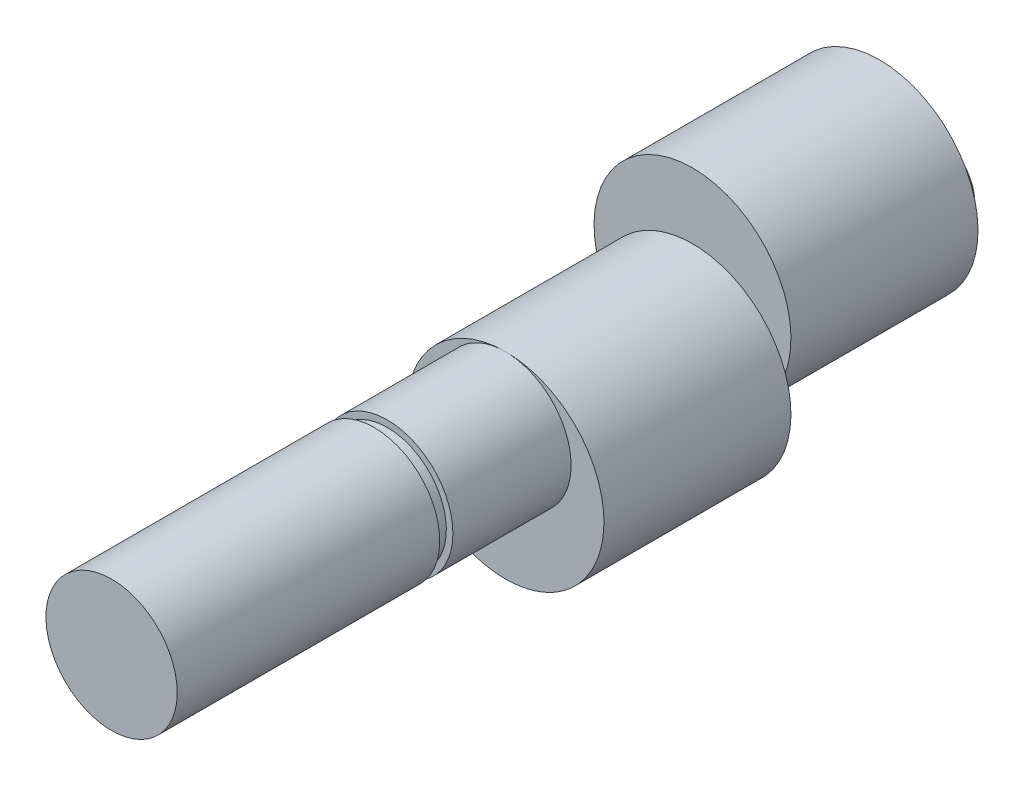
ISO-10303-21;
HEADER;
FILE_DESCRIPTION(('STEP AP214'),'2;1');
FILE_NAME('part.step','',(''),(''),'','','');
FILE_SCHEMA(('AUTOMOTIVE_DESIGN { 1 0 10303 214 1 1 1 1 }'));
ENDSEC;
DATA;
#1=APPLICATION_CONTEXT('core data for automotive mechanical design processes');
#2=APPLICATION_PROTOCOL_DEFINITION('international standard','automotive_design',2000,#1);
#3=PRODUCT_CONTEXT('',#1,'mechanical');
#4=PRODUCT('Part','Part','',(#3));
#5=PRODUCT_RELATED_PRODUCT_CATEGORY('part','',(#4));
#6=PRODUCT_DEFINITION_FORMATION('','',#4);
#7=PRODUCT_DEFINITION_CONTEXT('part definition',#1,'design');
#8=PRODUCT_DEFINITION('design','',#6,#7);
#9=PRODUCT_DEFINITION_SHAPE('','',#8);
#10=(LENGTH_UNIT() NAMED_UNIT(*) SI_UNIT(.MILLI.,.METRE.));
#11=(NAMED_UNIT(*) PLANE_ANGLE_UNIT() SI_UNIT($,.RADIAN.));
#12=(NAMED_UNIT(*) SI_UNIT($,.STERADIAN.) SOLID_ANGLE_UNIT());
#13=UNCERTAINTY_MEASURE_WITH_UNIT(LENGTH_MEASURE(1.E-05),#10,'distance_accuracy_value','');
#14=(GEOMETRIC_REPRESENTATION_CONTEXT(3) GLOBAL_UNCERTAINTY_ASSIGNED_CONTEXT((#13)) GLOBAL_UNIT_ASSIGNED_CONTEXT((#10,
#11,#12)) REPRESENTATION_CONTEXT('',''));
#15=CARTESIAN_POINT('',(0.,0.,0.));
#16=DIRECTION('',(0.,0.,1.));
#17=DIRECTION('',(1.,0.,0.));
#18=AXIS2_PLACEMENT_3D('',#15,#16,#17);
#19=CARTESIAN_POINT('',(0.,0.,44.25));
#20=DIRECTION('',(0.,0.,-1.));
#21=DIRECTION('',(-1.,0.,0.));
#22=AXIS2_PLACEMENT_3D('',#19,#20,#21);
#23=CYLINDRICAL_SURFACE('',#22,5.);
#24=CARTESIAN_POINT('',(0.,0.,14.25));
#25=DIRECTION('',(0.,0.,1.));
#26=DIRECTION('',(1.,0.,0.));
#27=AXIS2_PLACEMENT_3D('',#24,#25,#26);
#28=CIRCLE('',#27,5.);
#29=CARTESIAN_POINT('',(0.,5.,14.25));
#30=VERTEX_POINT('',#29);
#31=EDGE_CURVE('E87',#30,#30,#28,.T.);
#32=ORIENTED_EDGE('',*,*,#31,.T.);
#33=EDGE_LOOP('',(#32));
#34=FACE_BOUND('',#33,.T.);
#35=CARTESIAN_POINT('',(0.,0.,23.25));
#36=DIRECTION('',(0.,0.,1.));
#37=DIRECTION('',(0.,-1.,0.));
#38=AXIS2_PLACEMENT_3D('',#35,#36,#37);
#39=CIRCLE('',#38,5.);
#40=CARTESIAN_POINT('',(0.,-5.,23.25));
#41=VERTEX_POINT('',#40);
#42=EDGE_CURVE('E79',#41,#41,#39,.T.);
#43=ORIENTED_EDGE('',*,*,#42,.F.);
#44=EDGE_LOOP('',(#43));
#45=FACE_BOUND('',#44,.T.);
#46=ADVANCED_FACE('F40',(#34,#45),#23,.T.);
#47=CARTESIAN_POINT('',(0.,-2.5,14.25));
#48=DIRECTION('',(0.,0.,-1.));
#49=DIRECTION('',(-1.,0.,0.));
#50=AXIS2_PLACEMENT_3D('',#47,#48,#49);
#51=CYLINDRICAL_SURFACE('',#50,7.5);
#52=CARTESIAN_POINT('',(0.,-2.5,14.25));
#53=DIRECTION('',(0.,0.,1.));
#54=DIRECTION('',(1.,0.,0.));
#55=AXIS2_PLACEMENT_3D('',#52,#53,#54);
#56=CIRCLE('',#55,7.5);
#57=EDGE_CURVE('E50',#30,#30,#56,.T.);
#58=ORIENTED_EDGE('',*,*,#57,.F.);
#59=EDGE_LOOP('',(#58));
#60=FACE_BOUND('',#59,.T.);
#61=CARTESIAN_POINT('',(0.,-2.5,0.));
#62=DIRECTION('',(0.,0.,1.));
#63=DIRECTION('',(1.,0.,0.));
#64=AXIS2_PLACEMENT_3D('',#61,#62,#63);
#65=CIRCLE('',#64,7.5);
#66=CARTESIAN_POINT('',(7.07106781186547,0.,0.));
#67=VERTEX_POINT('',#66);
#68=CARTESIAN_POINT('',(-7.07106781186547,0.,0.));
#69=VERTEX_POINT('',#68);
#70=EDGE_CURVE('E63',#67,#69,#65,.T.);
#71=ORIENTED_EDGE('',*,*,#70,.T.);
#72=EDGE_CURVE('E75',#69,#67,#65,.T.);
#73=ORIENTED_EDGE('',*,*,#72,.T.);
#74=EDGE_LOOP('',(#71,#73));
#75=FACE_BOUND('',#74,.T.);
#76=ADVANCED_FACE('F42',(#60,#75),#51,.T.);
#77=CARTESIAN_POINT('',(0.,-2.5,14.25));
#78=DIRECTION('',(0.,0.,1.));
#79=DIRECTION('',(1.,0.,0.));
#80=AXIS2_PLACEMENT_3D('',#77,#78,#79);
#81=PLANE('',#80);
#82=ORIENTED_EDGE('',*,*,#57,.T.);
#83=ORIENTED_EDGE('',*,*,#31,.F.);
#84=EDGE_LOOP('',(#82,#83));
#85=FACE_BOUND('',#84,.T.);
#86=ADVANCED_FACE('F142',(#85),#81,.T.);
#87=CARTESIAN_POINT('',(0.,-2.5,0.));
#88=DIRECTION('',(0.,0.,1.));
#89=DIRECTION('',(1.,0.,0.));
#90=AXIS2_PLACEMENT_3D('',#87,#88,#89);
#91=PLANE('',#90);
#92=CARTESIAN_POINT('',(0.,2.5,0.));
#93=DIRECTION('',(0.,0.,-1.));
#94=DIRECTION('',(-1.,0.,0.));
#95=AXIS2_PLACEMENT_3D('',#92,#93,#94);
#96=CIRCLE('',#95,7.5);
#97=EDGE_CURVE('E57',#67,#69,#96,.T.);
#98=ORIENTED_EDGE('',*,*,#97,.F.);
#99=ORIENTED_EDGE('',*,*,#72,.F.);
#100=EDGE_LOOP('',(#98,#99));
#101=FACE_BOUND('',#100,.T.);
#102=ADVANCED_FACE('F223',(#101),#91,.F.);
#103=CARTESIAN_POINT('',(0.,2.5,-14.25));
#104=DIRECTION('',(0.,0.,1.));
#105=DIRECTION('',(1.,0.,0.));
#106=AXIS2_PLACEMENT_3D('',#103,#104,#105);
#107=CYLINDRICAL_SURFACE('',#106,7.5);
#108=CARTESIAN_POINT('',(0.,2.5,-14.25));
#109=DIRECTION('',(0.,0.,-1.));
#110=DIRECTION('',(-1.,0.,0.));
#111=AXIS2_PLACEMENT_3D('',#108,#109,#110);
#112=CIRCLE('',#111,7.5);
#113=CARTESIAN_POINT('',(-7.5,2.5,-14.25));
#114=VERTEX_POINT('',#113);
#115=EDGE_CURVE('E107',#114,#114,#112,.T.);
#116=ORIENTED_EDGE('',*,*,#115,.F.);
#117=EDGE_LOOP('',(#116));
#118=FACE_BOUND('',#117,.T.);
#119=ORIENTED_EDGE('',*,*,#97,.T.);
#120=EDGE_CURVE('E106',#69,#67,#96,.T.);
#121=ORIENTED_EDGE('',*,*,#120,.T.);
#122=EDGE_LOOP('',(#119,#121));
#123=FACE_BOUND('',#122,.T.);
#124=ADVANCED_FACE('F118',(#118,#123),#107,.T.);
#125=CARTESIAN_POINT('',(0.,2.5,-14.25));
#126=DIRECTION('',(0.,0.,-1.));
#127=DIRECTION('',(-1.,0.,0.));
#128=AXIS2_PLACEMENT_3D('',#125,#126,#127);
#129=PLANE('',#128);
#130=CARTESIAN_POINT('',(0.,0.,-14.25));
#131=DIRECTION('',(0.,0.,-1.));
#132=DIRECTION('',(-1.,0.,0.));
#133=AXIS2_PLACEMENT_3D('',#130,#131,#132);
#134=CIRCLE('',#133,3.00000000000004);
#135=CARTESIAN_POINT('',(-3.00000000000004,0.,-14.25));
#136=VERTEX_POINT('',#135);
#137=EDGE_CURVE('E11',#136,#136,#134,.T.);
#138=ORIENTED_EDGE('',*,*,#137,.F.);
#139=EDGE_LOOP('',(#138));
#140=FACE_BOUND('',#139,.T.);
#141=ORIENTED_EDGE('',*,*,#115,.T.);
#142=EDGE_LOOP('',(#141));
#143=FACE_BOUND('',#142,.T.);
#144=ADVANCED_FACE('F123',(#140,#143),#129,.T.);
#145=CARTESIAN_POINT('',(0.,2.5,0.));
#146=DIRECTION('',(0.,0.,-1.));
#147=DIRECTION('',(-1.,0.,0.));
#148=AXIS2_PLACEMENT_3D('',#145,#146,#147);
#149=PLANE('',#148);
#150=ORIENTED_EDGE('',*,*,#70,.F.);
#151=ORIENTED_EDGE('',*,*,#120,.F.);
#152=EDGE_LOOP('',(#150,#151));
#153=FACE_BOUND('',#152,.T.);
#154=ADVANCED_FACE('F120',(#153),#149,.F.);
#155=CARTESIAN_POINT('',(0.,0.,-18.5));
#156=DIRECTION('',(0.,0.,1.));
#157=DIRECTION('',(1.,0.,0.));
#158=AXIS2_PLACEMENT_3D('',#155,#156,#157);
#159=CYLINDRICAL_SURFACE('',#158,3.00000000000004);
#160=CARTESIAN_POINT('',(0.,0.,-18.5));
#161=DIRECTION('',(0.,0.,-1.));
#162=DIRECTION('',(-1.,0.,0.));
#163=AXIS2_PLACEMENT_3D('',#160,#161,#162);
#164=CIRCLE('',#163,3.00000000000004);
#165=CARTESIAN_POINT('',(-3.00000000000004,0.,-18.5));
#166=VERTEX_POINT('',#165);
#167=EDGE_CURVE('E100',#166,#166,#164,.T.);
#168=ORIENTED_EDGE('',*,*,#167,.F.);
#169=EDGE_LOOP('',(#168));
#170=FACE_BOUND('',#169,.T.);
#171=ORIENTED_EDGE('',*,*,#137,.T.);
#172=EDGE_LOOP('',(#171));
#173=FACE_BOUND('',#172,.T.);
#174=ADVANCED_FACE('F122',(#170,#173),#159,.T.);
#175=CARTESIAN_POINT('',(0.,0.,-18.5));
#176=DIRECTION('',(0.,0.,-1.));
#177=DIRECTION('',(-1.,0.,0.));
#178=AXIS2_PLACEMENT_3D('',#175,#176,#177);
#179=PLANE('',#178);
#180=ORIENTED_EDGE('',*,*,#167,.T.);
#181=EDGE_LOOP('',(#180));
#182=FACE_BOUND('',#181,.T.);
#183=ADVANCED_FACE('F129',(#182),#179,.T.);
#184=CARTESIAN_POINT('',(0.,6.79148285814403,24.25));
#185=DIRECTION('',(0.,0.,-1.));
#186=DIRECTION('',(0.,1.,0.));
#187=AXIS2_PLACEMENT_3D('',#184,#185,#186);
#188=PLANE('',#187);
#189=CARTESIAN_POINT('',(0.,0.,24.25));
#190=DIRECTION('',(0.,0.,1.));
#191=DIRECTION('',(0.,-1.,0.));
#192=AXIS2_PLACEMENT_3D('',#189,#190,#191);
#193=CIRCLE('',#192,4.5);
#194=CARTESIAN_POINT('',(0.,-4.5,24.25));
#195=VERTEX_POINT('',#194);
#196=EDGE_CURVE('E82',#195,#195,#193,.T.);
#197=ORIENTED_EDGE('',*,*,#196,.T.);
#198=EDGE_LOOP('',(#197));
#199=FACE_BOUND('',#198,.T.);
#200=CARTESIAN_POINT('',(0.,0.,24.25));
#201=DIRECTION('',(0.,0.,-1.));
#202=DIRECTION('',(0.,1.,0.));
#203=AXIS2_PLACEMENT_3D('',#200,#201,#202);
#204=CIRCLE('',#203,5.);
#205=CARTESIAN_POINT('',(0.,5.,24.25));
#206=VERTEX_POINT('',#205);
#207=EDGE_CURVE('E44',#206,#206,#204,.T.);
#208=ORIENTED_EDGE('',*,*,#207,.T.);
#209=EDGE_LOOP('',(#208));
#210=FACE_BOUND('',#209,.T.);
#211=ADVANCED_FACE('F158',(#199,#210),#188,.T.);
#212=CARTESIAN_POINT('',(0.,6.79148285814403,23.25));
#213=DIRECTION('',(0.,0.,1.));
#214=DIRECTION('',(0.,-1.,0.));
#215=AXIS2_PLACEMENT_3D('',#212,#213,#214);
#216=PLANE('',#215);
#217=CARTESIAN_POINT('',(0.,0.,23.25));
#218=DIRECTION('',(0.,0.,1.));
#219=DIRECTION('',(0.,-1.,0.));
#220=AXIS2_PLACEMENT_3D('',#217,#218,#219);
#221=CIRCLE('',#220,4.5);
#222=CARTESIAN_POINT('',(0.,-4.5,23.25));
#223=VERTEX_POINT('',#222);
#224=EDGE_CURVE('E89',#223,#223,#221,.T.);
#225=ORIENTED_EDGE('',*,*,#224,.F.);
#226=EDGE_LOOP('',(#225));
#227=FACE_BOUND('',#226,.T.);
#228=ORIENTED_EDGE('',*,*,#42,.T.);
#229=EDGE_LOOP('',(#228));
#230=FACE_BOUND('',#229,.T.);
#231=ADVANCED_FACE('F160',(#227,#230),#216,.T.);
#232=CARTESIAN_POINT('',(0.,0.,44.25));
#233=DIRECTION('',(0.,0.,1.));
#234=DIRECTION('',(0.,-1.,0.));
#235=AXIS2_PLACEMENT_3D('',#232,#233,#234);
#236=CYLINDRICAL_SURFACE('',#235,4.5);
#237=ORIENTED_EDGE('',*,*,#224,.T.);
#238=EDGE_LOOP('',(#237));
#239=FACE_BOUND('',#238,.T.);
#240=ORIENTED_EDGE('',*,*,#196,.F.);
#241=EDGE_LOOP('',(#240));
#242=FACE_BOUND('',#241,.T.);
#243=ADVANCED_FACE('F152',(#239,#242),#236,.T.);
#244=CARTESIAN_POINT('',(0.,0.,44.25));
#245=DIRECTION('',(0.,0.,1.));
#246=DIRECTION('',(1.,0.,0.));
#247=AXIS2_PLACEMENT_3D('',#244,#245,#246);
#248=PLANE('',#247);
#249=CARTESIAN_POINT('',(0.,0.,44.25));
#250=DIRECTION('',(0.,0.,1.));
#251=DIRECTION('',(1.,0.,0.));
#252=AXIS2_PLACEMENT_3D('',#249,#250,#251);
#253=CIRCLE('',#252,5.);
#254=CARTESIAN_POINT('',(5.,0.,44.25));
#255=VERTEX_POINT('',#254);
#256=EDGE_CURVE('E97',#255,#255,#253,.T.);
#257=ORIENTED_EDGE('',*,*,#256,.T.);
#258=EDGE_LOOP('',(#257));
#259=FACE_BOUND('',#258,.T.);
#260=ADVANCED_FACE('F147',(#259),#248,.T.);
#261=ORIENTED_EDGE('',*,*,#256,.F.);
#262=EDGE_LOOP('',(#261));
#263=FACE_BOUND('',#262,.T.);
#264=ORIENTED_EDGE('',*,*,#207,.F.);
#265=EDGE_LOOP('',(#264));
#266=FACE_BOUND('',#265,.T.);
#267=ADVANCED_FACE('F138',(#263,#266),#23,.T.);
#268=CLOSED_SHELL('',(#46,#76,#86,#102,#124,#144,#154,#174,#183,#211,#231,#243,#260,#267));
#269=MANIFOLD_SOLID_BREP('B2',#268);
#270=ADVANCED_BREP_SHAPE_REPRESENTATION('',(#18,#269),#14);
#271=SHAPE_DEFINITION_REPRESENTATION(#9,#270);
ENDSEC;
END-ISO-10303-21;
